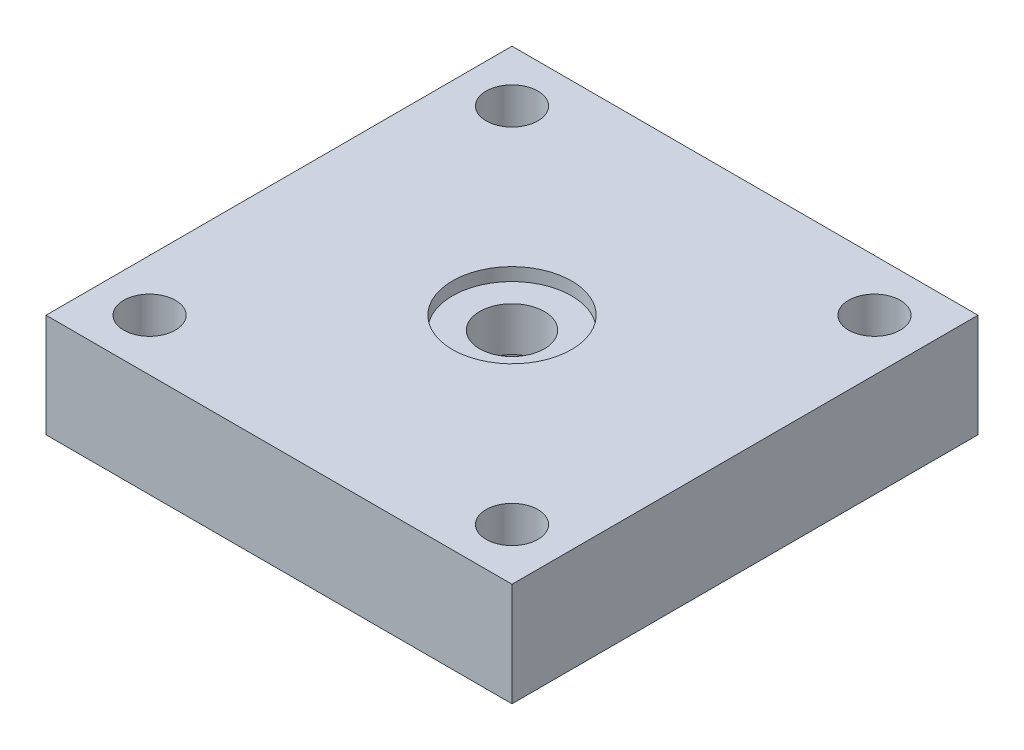
ISO-10303-21;
HEADER;
FILE_DESCRIPTION(('STEP AP214'),'2;1');
FILE_NAME('part.step','',(''),(''),'','','');
FILE_SCHEMA(('AUTOMOTIVE_DESIGN { 1 0 10303 214 1 1 1 1 }'));
ENDSEC;
DATA;
#1=APPLICATION_CONTEXT('core data for automotive mechanical design processes');
#2=APPLICATION_PROTOCOL_DEFINITION('international standard','automotive_design',2000,#1);
#3=PRODUCT_CONTEXT('',#1,'mechanical');
#4=PRODUCT('Part','Part','',(#3));
#5=PRODUCT_RELATED_PRODUCT_CATEGORY('part','',(#4));
#6=PRODUCT_DEFINITION_FORMATION('','',#4);
#7=PRODUCT_DEFINITION_CONTEXT('part definition',#1,'design');
#8=PRODUCT_DEFINITION('design','',#6,#7);
#9=PRODUCT_DEFINITION_SHAPE('','',#8);
#10=(LENGTH_UNIT() NAMED_UNIT(*) SI_UNIT(.MILLI.,.METRE.));
#11=(NAMED_UNIT(*) PLANE_ANGLE_UNIT() SI_UNIT($,.RADIAN.));
#12=(NAMED_UNIT(*) SI_UNIT($,.STERADIAN.) SOLID_ANGLE_UNIT());
#13=UNCERTAINTY_MEASURE_WITH_UNIT(LENGTH_MEASURE(1.E-05),#10,'distance_accuracy_value','');
#14=(GEOMETRIC_REPRESENTATION_CONTEXT(3) GLOBAL_UNCERTAINTY_ASSIGNED_CONTEXT((#13)) GLOBAL_UNIT_ASSIGNED_CONTEXT((#10,
#11,#12)) REPRESENTATION_CONTEXT('',''));
#15=CARTESIAN_POINT('',(0.,0.,0.));
#16=DIRECTION('',(0.,0.,1.));
#17=DIRECTION('',(1.,0.,0.));
#18=AXIS2_PLACEMENT_3D('',#15,#16,#17);
#19=CARTESIAN_POINT('',(0.,40.,0.));
#20=DIRECTION('',(0.,-1.,0.));
#21=DIRECTION('',(0.,0.,-1.));
#22=AXIS2_PLACEMENT_3D('',#19,#20,#21);
#23=PLANE('',#22);
#24=CARTESIAN_POINT('',(0.,40.,0.));
#25=DIRECTION('',(0.,1.,0.));
#26=DIRECTION('',(0.,0.,1.));
#27=AXIS2_PLACEMENT_3D('',#24,#25,#26);
#28=CIRCLE('',#27,23.);
#29=CARTESIAN_POINT('',(0.,40.,23.));
#30=VERTEX_POINT('',#29);
#31=EDGE_CURVE('E170',#30,#30,#28,.T.);
#32=ORIENTED_EDGE('',*,*,#31,.F.);
#33=EDGE_LOOP('',(#32));
#34=FACE_BOUND('',#33,.T.);
#35=DIRECTION('',(0.,0.,-1.));
#36=VECTOR('',#35,1.);
#37=CARTESIAN_POINT('',(90.,40.,90.));
#38=LINE('',#37,#36);
#39=CARTESIAN_POINT('',(90.,40.,90.));
#40=VERTEX_POINT('',#39);
#41=CARTESIAN_POINT('',(90.,40.,-90.));
#42=VERTEX_POINT('',#41);
#43=EDGE_CURVE('E99',#40,#42,#38,.T.);
#44=ORIENTED_EDGE('',*,*,#43,.T.);
#45=DIRECTION('',(-1.,0.,0.));
#46=VECTOR('',#45,1.);
#47=CARTESIAN_POINT('',(-90.,40.,-90.));
#48=LINE('',#47,#46);
#49=CARTESIAN_POINT('',(-90.,40.,-90.));
#50=VERTEX_POINT('',#49);
#51=EDGE_CURVE('E94',#42,#50,#48,.T.);
#52=ORIENTED_EDGE('',*,*,#51,.T.);
#53=DIRECTION('',(0.,0.,1.));
#54=VECTOR('',#53,1.);
#55=CARTESIAN_POINT('',(-90.,40.,90.));
#56=LINE('',#55,#54);
#57=CARTESIAN_POINT('',(-90.,40.,90.));
#58=VERTEX_POINT('',#57);
#59=EDGE_CURVE('E97',#50,#58,#56,.T.);
#60=ORIENTED_EDGE('',*,*,#59,.T.);
#61=DIRECTION('',(1.,0.,0.));
#62=VECTOR('',#61,1.);
#63=CARTESIAN_POINT('',(-90.,40.,90.));
#64=LINE('',#63,#62);
#65=EDGE_CURVE('E64',#58,#40,#64,.T.);
#66=ORIENTED_EDGE('',*,*,#65,.T.);
#67=EDGE_LOOP('',(#44,#52,#60,#66));
#68=FACE_BOUND('',#67,.T.);
#69=CARTESIAN_POINT('',(-70.,40.,-70.));
#70=DIRECTION('',(0.,1.,0.));
#71=DIRECTION('',(0.,0.,1.));
#72=AXIS2_PLACEMENT_3D('',#69,#70,#71);
#73=CIRCLE('',#72,9.99999999999999);
#74=CARTESIAN_POINT('',(-70.,40.,-60.));
#75=VERTEX_POINT('',#74);
#76=EDGE_CURVE('E120',#75,#75,#73,.T.);
#77=ORIENTED_EDGE('',*,*,#76,.F.);
#78=EDGE_LOOP('',(#77));
#79=FACE_BOUND('',#78,.T.);
#80=CARTESIAN_POINT('',(70.,40.,-70.));
#81=DIRECTION('',(0.,1.,0.));
#82=DIRECTION('',(0.,0.,1.));
#83=AXIS2_PLACEMENT_3D('',#80,#81,#82);
#84=CIRCLE('',#83,9.99999999999999);
#85=CARTESIAN_POINT('',(70.,40.,-60.));
#86=VERTEX_POINT('',#85);
#87=EDGE_CURVE('E142',#86,#86,#84,.T.);
#88=ORIENTED_EDGE('',*,*,#87,.F.);
#89=EDGE_LOOP('',(#88));
#90=FACE_BOUND('',#89,.T.);
#91=CARTESIAN_POINT('',(-70.,40.,70.));
#92=DIRECTION('',(0.,1.,0.));
#93=DIRECTION('',(0.,0.,1.));
#94=AXIS2_PLACEMENT_3D('',#91,#92,#93);
#95=CIRCLE('',#94,10.);
#96=CARTESIAN_POINT('',(-70.,40.,80.));
#97=VERTEX_POINT('',#96);
#98=EDGE_CURVE('E150',#97,#97,#95,.T.);
#99=ORIENTED_EDGE('',*,*,#98,.F.);
#100=EDGE_LOOP('',(#99));
#101=FACE_BOUND('',#100,.T.);
#102=CARTESIAN_POINT('',(70.,40.,70.));
#103=DIRECTION('',(0.,1.,0.));
#104=DIRECTION('',(0.,0.,1.));
#105=AXIS2_PLACEMENT_3D('',#102,#103,#104);
#106=CIRCLE('',#105,10.);
#107=CARTESIAN_POINT('',(70.,40.,80.));
#108=VERTEX_POINT('',#107);
#109=EDGE_CURVE('E158',#108,#108,#106,.T.);
#110=ORIENTED_EDGE('',*,*,#109,.F.);
#111=EDGE_LOOP('',(#110));
#112=FACE_BOUND('',#111,.T.);
#113=ADVANCED_FACE('F45',(#34,#68,#79,#90,#101,#112),#23,.F.);
#114=CARTESIAN_POINT('',(0.,0.,0.));
#115=DIRECTION('',(0.,-1.,0.));
#116=DIRECTION('',(0.,0.,-1.));
#117=AXIS2_PLACEMENT_3D('',#114,#115,#116);
#118=PLANE('',#117);
#119=CARTESIAN_POINT('',(0.,0.,0.));
#120=DIRECTION('',(0.,-1.,0.));
#121=DIRECTION('',(0.,0.,-1.));
#122=AXIS2_PLACEMENT_3D('',#119,#120,#121);
#123=CIRCLE('',#122,25.);
#124=CARTESIAN_POINT('',(0.,0.,-25.));
#125=VERTEX_POINT('',#124);
#126=EDGE_CURVE('E178',#125,#125,#123,.T.);
#127=ORIENTED_EDGE('',*,*,#126,.F.);
#128=EDGE_LOOP('',(#127));
#129=FACE_BOUND('',#128,.T.);
#130=CARTESIAN_POINT('',(-70.,0.,70.));
#131=DIRECTION('',(0.,1.,0.));
#132=DIRECTION('',(0.,0.,1.));
#133=AXIS2_PLACEMENT_3D('',#130,#131,#132);
#134=CIRCLE('',#133,10.);
#135=CARTESIAN_POINT('',(-70.,0.,80.));
#136=VERTEX_POINT('',#135);
#137=EDGE_CURVE('E154',#136,#136,#134,.T.);
#138=ORIENTED_EDGE('',*,*,#137,.T.);
#139=EDGE_LOOP('',(#138));
#140=FACE_BOUND('',#139,.T.);
#141=CARTESIAN_POINT('',(-70.,0.,-70.));
#142=DIRECTION('',(0.,1.,0.));
#143=DIRECTION('',(0.,0.,1.));
#144=AXIS2_PLACEMENT_3D('',#141,#142,#143);
#145=CIRCLE('',#144,9.99999999999999);
#146=CARTESIAN_POINT('',(-70.,0.,-60.));
#147=VERTEX_POINT('',#146);
#148=EDGE_CURVE('E138',#147,#147,#145,.T.);
#149=ORIENTED_EDGE('',*,*,#148,.T.);
#150=EDGE_LOOP('',(#149));
#151=FACE_BOUND('',#150,.T.);
#152=DIRECTION('',(0.,0.,-1.));
#153=VECTOR('',#152,1.);
#154=CARTESIAN_POINT('',(90.,0.,90.));
#155=LINE('',#154,#153);
#156=CARTESIAN_POINT('',(90.,0.,90.));
#157=VERTEX_POINT('',#156);
#158=CARTESIAN_POINT('',(90.,0.,-90.));
#159=VERTEX_POINT('',#158);
#160=EDGE_CURVE('E116',#157,#159,#155,.T.);
#161=ORIENTED_EDGE('',*,*,#160,.F.);
#162=DIRECTION('',(1.,0.,0.));
#163=VECTOR('',#162,1.);
#164=CARTESIAN_POINT('',(-90.,0.,90.));
#165=LINE('',#164,#163);
#166=CARTESIAN_POINT('',(-90.,0.,90.));
#167=VERTEX_POINT('',#166);
#168=EDGE_CURVE('E87',#167,#157,#165,.T.);
#169=ORIENTED_EDGE('',*,*,#168,.F.);
#170=DIRECTION('',(0.,0.,1.));
#171=VECTOR('',#170,1.);
#172=CARTESIAN_POINT('',(-90.,0.,90.));
#173=LINE('',#172,#171);
#174=CARTESIAN_POINT('',(-90.,0.,-90.));
#175=VERTEX_POINT('',#174);
#176=EDGE_CURVE('E81',#175,#167,#173,.T.);
#177=ORIENTED_EDGE('',*,*,#176,.F.);
#178=DIRECTION('',(-1.,0.,0.));
#179=VECTOR('',#178,1.);
#180=CARTESIAN_POINT('',(-90.,0.,-90.));
#181=LINE('',#180,#179);
#182=EDGE_CURVE('E104',#159,#175,#181,.T.);
#183=ORIENTED_EDGE('',*,*,#182,.F.);
#184=EDGE_LOOP('',(#161,#169,#177,#183));
#185=FACE_BOUND('',#184,.T.);
#186=CARTESIAN_POINT('',(70.,0.,-70.));
#187=DIRECTION('',(0.,1.,0.));
#188=DIRECTION('',(0.,0.,1.));
#189=AXIS2_PLACEMENT_3D('',#186,#187,#188);
#190=CIRCLE('',#189,9.99999999999999);
#191=CARTESIAN_POINT('',(70.,0.,-60.));
#192=VERTEX_POINT('',#191);
#193=EDGE_CURVE('E146',#192,#192,#190,.T.);
#194=ORIENTED_EDGE('',*,*,#193,.T.);
#195=EDGE_LOOP('',(#194));
#196=FACE_BOUND('',#195,.T.);
#197=CARTESIAN_POINT('',(70.,0.,70.));
#198=DIRECTION('',(0.,1.,0.));
#199=DIRECTION('',(0.,0.,1.));
#200=AXIS2_PLACEMENT_3D('',#197,#198,#199);
#201=CIRCLE('',#200,10.);
#202=CARTESIAN_POINT('',(70.,0.,80.));
#203=VERTEX_POINT('',#202);
#204=EDGE_CURVE('E162',#203,#203,#201,.T.);
#205=ORIENTED_EDGE('',*,*,#204,.T.);
#206=EDGE_LOOP('',(#205));
#207=FACE_BOUND('',#206,.T.);
#208=ADVANCED_FACE('F133',(#129,#140,#151,#185,#196,#207),#118,.T.);
#209=CARTESIAN_POINT('',(90.,40.,90.));
#210=DIRECTION('',(-1.,0.,0.));
#211=DIRECTION('',(0.,0.,1.));
#212=AXIS2_PLACEMENT_3D('',#209,#210,#211);
#213=PLANE('',#212);
#214=ORIENTED_EDGE('',*,*,#160,.T.);
#215=DIRECTION('',(0.,-1.,0.));
#216=VECTOR('',#215,1.);
#217=CARTESIAN_POINT('',(90.,40.,-90.));
#218=LINE('',#217,#216);
#219=EDGE_CURVE('E11',#42,#159,#218,.T.);
#220=ORIENTED_EDGE('',*,*,#219,.F.);
#221=ORIENTED_EDGE('',*,*,#43,.F.);
#222=DIRECTION('',(0.,-1.,0.));
#223=VECTOR('',#222,1.);
#224=CARTESIAN_POINT('',(90.,40.,90.));
#225=LINE('',#224,#223);
#226=EDGE_CURVE('E112',#40,#157,#225,.T.);
#227=ORIENTED_EDGE('',*,*,#226,.T.);
#228=EDGE_LOOP('',(#214,#220,#221,#227));
#229=FACE_BOUND('',#228,.T.);
#230=ADVANCED_FACE('F47',(#229),#213,.F.);
#231=CARTESIAN_POINT('',(-90.,40.,-90.));
#232=DIRECTION('',(0.,0.,1.));
#233=DIRECTION('',(1.,0.,0.));
#234=AXIS2_PLACEMENT_3D('',#231,#232,#233);
#235=PLANE('',#234);
#236=ORIENTED_EDGE('',*,*,#182,.T.);
#237=DIRECTION('',(0.,-1.,0.));
#238=VECTOR('',#237,1.);
#239=CARTESIAN_POINT('',(-90.,40.,-90.));
#240=LINE('',#239,#238);
#241=EDGE_CURVE('E56',#50,#175,#240,.T.);
#242=ORIENTED_EDGE('',*,*,#241,.F.);
#243=ORIENTED_EDGE('',*,*,#51,.F.);
#244=ORIENTED_EDGE('',*,*,#219,.T.);
#245=EDGE_LOOP('',(#236,#242,#243,#244));
#246=FACE_BOUND('',#245,.T.);
#247=ADVANCED_FACE('F103',(#246),#235,.F.);
#248=CARTESIAN_POINT('',(-90.,40.,90.));
#249=DIRECTION('',(1.,0.,0.));
#250=DIRECTION('',(0.,0.,-1.));
#251=AXIS2_PLACEMENT_3D('',#248,#249,#250);
#252=PLANE('',#251);
#253=ORIENTED_EDGE('',*,*,#176,.T.);
#254=DIRECTION('',(0.,-1.,0.));
#255=VECTOR('',#254,1.);
#256=CARTESIAN_POINT('',(-90.,40.,90.));
#257=LINE('',#256,#255);
#258=EDGE_CURVE('E106',#58,#167,#257,.T.);
#259=ORIENTED_EDGE('',*,*,#258,.F.);
#260=ORIENTED_EDGE('',*,*,#59,.F.);
#261=ORIENTED_EDGE('',*,*,#241,.T.);
#262=EDGE_LOOP('',(#253,#259,#260,#261));
#263=FACE_BOUND('',#262,.T.);
#264=ADVANCED_FACE('F108',(#263),#252,.F.);
#265=CARTESIAN_POINT('',(-90.,40.,90.));
#266=DIRECTION('',(0.,0.,-1.));
#267=DIRECTION('',(-1.,0.,0.));
#268=AXIS2_PLACEMENT_3D('',#265,#266,#267);
#269=PLANE('',#268);
#270=ORIENTED_EDGE('',*,*,#168,.T.);
#271=ORIENTED_EDGE('',*,*,#226,.F.);
#272=ORIENTED_EDGE('',*,*,#65,.F.);
#273=ORIENTED_EDGE('',*,*,#258,.T.);
#274=EDGE_LOOP('',(#270,#271,#272,#273));
#275=FACE_BOUND('',#274,.T.);
#276=ADVANCED_FACE('F130',(#275),#269,.F.);
#277=CARTESIAN_POINT('',(-70.,40.,-70.));
#278=DIRECTION('',(0.,-1.,0.));
#279=DIRECTION('',(0.,0.,-1.));
#280=AXIS2_PLACEMENT_3D('',#277,#278,#279);
#281=CYLINDRICAL_SURFACE('',#280,9.99999999999999);
#282=ORIENTED_EDGE('',*,*,#76,.T.);
#283=EDGE_LOOP('',(#282));
#284=FACE_BOUND('',#283,.T.);
#285=ORIENTED_EDGE('',*,*,#148,.F.);
#286=EDGE_LOOP('',(#285));
#287=FACE_BOUND('',#286,.T.);
#288=ADVANCED_FACE('F219',(#284,#287),#281,.F.);
#289=CARTESIAN_POINT('',(70.,40.,-70.));
#290=DIRECTION('',(0.,-1.,0.));
#291=DIRECTION('',(0.,0.,-1.));
#292=AXIS2_PLACEMENT_3D('',#289,#290,#291);
#293=CYLINDRICAL_SURFACE('',#292,9.99999999999999);
#294=ORIENTED_EDGE('',*,*,#87,.T.);
#295=EDGE_LOOP('',(#294));
#296=FACE_BOUND('',#295,.T.);
#297=ORIENTED_EDGE('',*,*,#193,.F.);
#298=EDGE_LOOP('',(#297));
#299=FACE_BOUND('',#298,.T.);
#300=ADVANCED_FACE('F261',(#296,#299),#293,.F.);
#301=CARTESIAN_POINT('',(-70.,40.,70.));
#302=DIRECTION('',(0.,-1.,0.));
#303=DIRECTION('',(0.,0.,-1.));
#304=AXIS2_PLACEMENT_3D('',#301,#302,#303);
#305=CYLINDRICAL_SURFACE('',#304,10.);
#306=ORIENTED_EDGE('',*,*,#98,.T.);
#307=EDGE_LOOP('',(#306));
#308=FACE_BOUND('',#307,.T.);
#309=ORIENTED_EDGE('',*,*,#137,.F.);
#310=EDGE_LOOP('',(#309));
#311=FACE_BOUND('',#310,.T.);
#312=ADVANCED_FACE('F270',(#308,#311),#305,.F.);
#313=CARTESIAN_POINT('',(70.,40.,70.));
#314=DIRECTION('',(0.,-1.,0.));
#315=DIRECTION('',(0.,0.,-1.));
#316=AXIS2_PLACEMENT_3D('',#313,#314,#315);
#317=CYLINDRICAL_SURFACE('',#316,10.);
#318=ORIENTED_EDGE('',*,*,#109,.T.);
#319=EDGE_LOOP('',(#318));
#320=FACE_BOUND('',#319,.T.);
#321=ORIENTED_EDGE('',*,*,#204,.F.);
#322=EDGE_LOOP('',(#321));
#323=FACE_BOUND('',#322,.T.);
#324=ADVANCED_FACE('F206',(#320,#323),#317,.F.);
#325=CARTESIAN_POINT('',(0.,35.,0.));
#326=DIRECTION('',(0.,1.,0.));
#327=DIRECTION('',(0.,0.,1.));
#328=AXIS2_PLACEMENT_3D('',#325,#326,#327);
#329=CYLINDRICAL_SURFACE('',#328,23.);
#330=CARTESIAN_POINT('',(0.,35.,0.));
#331=DIRECTION('',(0.,1.,0.));
#332=DIRECTION('',(0.,0.,1.));
#333=AXIS2_PLACEMENT_3D('',#330,#331,#332);
#334=CIRCLE('',#333,23.);
#335=CARTESIAN_POINT('',(0.,35.,23.));
#336=VERTEX_POINT('',#335);
#337=EDGE_CURVE('E166',#336,#336,#334,.T.);
#338=ORIENTED_EDGE('',*,*,#337,.F.);
#339=EDGE_LOOP('',(#338));
#340=FACE_BOUND('',#339,.T.);
#341=ORIENTED_EDGE('',*,*,#31,.T.);
#342=EDGE_LOOP('',(#341));
#343=FACE_BOUND('',#342,.T.);
#344=ADVANCED_FACE('F200',(#340,#343),#329,.F.);
#345=CARTESIAN_POINT('',(0.,35.,0.));
#346=DIRECTION('',(0.,1.,0.));
#347=DIRECTION('',(0.,0.,1.));
#348=AXIS2_PLACEMENT_3D('',#345,#346,#347);
#349=PLANE('',#348);
#350=CARTESIAN_POINT('',(0.,35.,0.));
#351=DIRECTION('',(0.,1.,0.));
#352=DIRECTION('',(0.,0.,1.));
#353=AXIS2_PLACEMENT_3D('',#350,#351,#352);
#354=CIRCLE('',#353,12.5);
#355=CARTESIAN_POINT('',(0.,35.,12.5));
#356=VERTEX_POINT('',#355);
#357=EDGE_CURVE('E49',#356,#356,#354,.T.);
#358=ORIENTED_EDGE('',*,*,#357,.F.);
#359=EDGE_LOOP('',(#358));
#360=FACE_BOUND('',#359,.T.);
#361=ORIENTED_EDGE('',*,*,#337,.T.);
#362=EDGE_LOOP('',(#361));
#363=FACE_BOUND('',#362,.T.);
#364=ADVANCED_FACE('F196',(#360,#363),#349,.T.);
#365=CARTESIAN_POINT('',(0.,18.,0.));
#366=DIRECTION('',(0.,-1.,0.));
#367=DIRECTION('',(0.,0.,-1.));
#368=AXIS2_PLACEMENT_3D('',#365,#366,#367);
#369=CYLINDRICAL_SURFACE('',#368,25.);
#370=CARTESIAN_POINT('',(0.,18.,0.));
#371=DIRECTION('',(0.,-1.,0.));
#372=DIRECTION('',(0.,0.,-1.));
#373=AXIS2_PLACEMENT_3D('',#370,#371,#372);
#374=CIRCLE('',#373,25.);
#375=CARTESIAN_POINT('',(0.,18.,-25.));
#376=VERTEX_POINT('',#375);
#377=EDGE_CURVE('E174',#376,#376,#374,.T.);
#378=ORIENTED_EDGE('',*,*,#377,.F.);
#379=EDGE_LOOP('',(#378));
#380=FACE_BOUND('',#379,.T.);
#381=ORIENTED_EDGE('',*,*,#126,.T.);
#382=EDGE_LOOP('',(#381));
#383=FACE_BOUND('',#382,.T.);
#384=ADVANCED_FACE('F199',(#380,#383),#369,.F.);
#385=CARTESIAN_POINT('',(0.,18.,0.));
#386=DIRECTION('',(0.,-1.,0.));
#387=DIRECTION('',(0.,0.,-1.));
#388=AXIS2_PLACEMENT_3D('',#385,#386,#387);
#389=PLANE('',#388);
#390=CARTESIAN_POINT('',(0.,18.,0.));
#391=DIRECTION('',(0.,-1.,0.));
#392=DIRECTION('',(0.,0.,-1.));
#393=AXIS2_PLACEMENT_3D('',#390,#391,#392);
#394=CIRCLE('',#393,12.5);
#395=CARTESIAN_POINT('',(0.,18.,-12.5));
#396=VERTEX_POINT('',#395);
#397=EDGE_CURVE('E185',#396,#396,#394,.T.);
#398=ORIENTED_EDGE('',*,*,#397,.F.);
#399=EDGE_LOOP('',(#398));
#400=FACE_BOUND('',#399,.T.);
#401=ORIENTED_EDGE('',*,*,#377,.T.);
#402=EDGE_LOOP('',(#401));
#403=FACE_BOUND('',#402,.T.);
#404=ADVANCED_FACE('F309',(#400,#403),#389,.T.);
#405=CARTESIAN_POINT('',(0.,36.,0.));
#406=DIRECTION('',(0.,-1.,0.));
#407=DIRECTION('',(0.,0.,-1.));
#408=AXIS2_PLACEMENT_3D('',#405,#406,#407);
#409=CYLINDRICAL_SURFACE('',#408,12.5);
#410=ORIENTED_EDGE('',*,*,#357,.T.);
#411=EDGE_LOOP('',(#410));
#412=FACE_BOUND('',#411,.T.);
#413=ORIENTED_EDGE('',*,*,#397,.T.);
#414=EDGE_LOOP('',(#413));
#415=FACE_BOUND('',#414,.T.);
#416=ADVANCED_FACE('F194',(#412,#415),#409,.F.);
#417=CLOSED_SHELL('',(#113,#208,#230,#247,#264,#276,#288,#300,#312,#324,#344,#364,#384,#404,#416));
#418=MANIFOLD_SOLID_BREP('B2',#417);
#419=ADVANCED_BREP_SHAPE_REPRESENTATION('',(#18,#418),#14);
#420=SHAPE_DEFINITION_REPRESENTATION(#9,#419);
ENDSEC;
END-ISO-10303-21;
